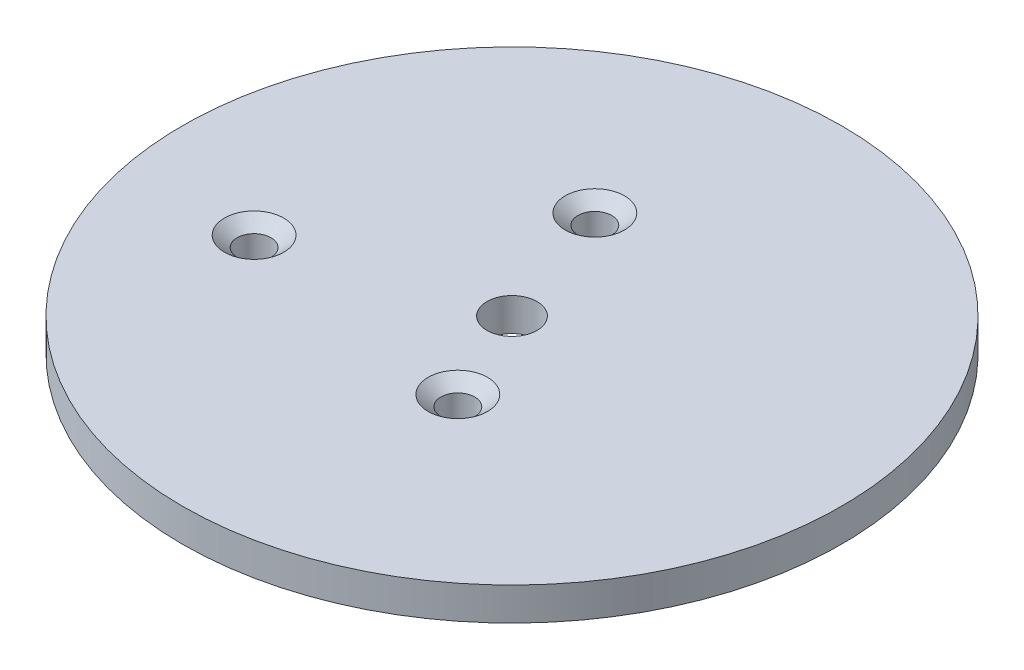
ISO-10303-21;
HEADER;
FILE_DESCRIPTION(('STEP AP214'),'2;1');
FILE_NAME('part.step','',(''),(''),'','','');
FILE_SCHEMA(('AUTOMOTIVE_DESIGN { 1 0 10303 214 1 1 1 1 }'));
ENDSEC;
DATA;
#1=APPLICATION_CONTEXT('core data for automotive mechanical design processes');
#2=APPLICATION_PROTOCOL_DEFINITION('international standard','automotive_design',2000,#1);
#3=PRODUCT_CONTEXT('',#1,'mechanical');
#4=PRODUCT('Part','Part','',(#3));
#5=PRODUCT_RELATED_PRODUCT_CATEGORY('part','',(#4));
#6=PRODUCT_DEFINITION_FORMATION('','',#4);
#7=PRODUCT_DEFINITION_CONTEXT('part definition',#1,'design');
#8=PRODUCT_DEFINITION('design','',#6,#7);
#9=PRODUCT_DEFINITION_SHAPE('','',#8);
#10=(LENGTH_UNIT() NAMED_UNIT(*) SI_UNIT(.MILLI.,.METRE.));
#11=(NAMED_UNIT(*) PLANE_ANGLE_UNIT() SI_UNIT($,.RADIAN.));
#12=(NAMED_UNIT(*) SI_UNIT($,.STERADIAN.) SOLID_ANGLE_UNIT());
#13=UNCERTAINTY_MEASURE_WITH_UNIT(LENGTH_MEASURE(1.E-05),#10,'distance_accuracy_value','');
#14=(GEOMETRIC_REPRESENTATION_CONTEXT(3) GLOBAL_UNCERTAINTY_ASSIGNED_CONTEXT((#13)) GLOBAL_UNIT_ASSIGNED_CONTEXT((#10,
#11,#12)) REPRESENTATION_CONTEXT('',''));
#15=CARTESIAN_POINT('',(0.,0.,0.));
#16=DIRECTION('',(0.,0.,1.));
#17=DIRECTION('',(1.,0.,0.));
#18=AXIS2_PLACEMENT_3D('',#15,#16,#17);
#19=CARTESIAN_POINT('',(0.,3.175,0.));
#20=DIRECTION('',(0.,-1.,0.));
#21=DIRECTION('',(0.,0.,-1.));
#22=AXIS2_PLACEMENT_3D('',#19,#20,#21);
#23=CYLINDRICAL_SURFACE('',#22,31.75);
#24=CARTESIAN_POINT('',(0.,3.175,0.));
#25=DIRECTION('',(0.,1.,0.));
#26=DIRECTION('',(0.,0.,1.));
#27=AXIS2_PLACEMENT_3D('',#24,#25,#26);
#28=CIRCLE('',#27,31.75);
#29=CARTESIAN_POINT('',(0.,3.175,31.75));
#30=VERTEX_POINT('',#29);
#31=EDGE_CURVE('E10',#30,#30,#28,.T.);
#32=ORIENTED_EDGE('',*,*,#31,.F.);
#33=EDGE_LOOP('',(#32));
#34=FACE_BOUND('',#33,.T.);
#35=CARTESIAN_POINT('',(0.,0.,0.));
#36=DIRECTION('',(0.,1.,0.));
#37=DIRECTION('',(0.,0.,1.));
#38=AXIS2_PLACEMENT_3D('',#35,#36,#37);
#39=CIRCLE('',#38,31.75);
#40=CARTESIAN_POINT('',(0.,0.,31.75));
#41=VERTEX_POINT('',#40);
#42=EDGE_CURVE('E38',#41,#41,#39,.T.);
#43=ORIENTED_EDGE('',*,*,#42,.T.);
#44=EDGE_LOOP('',(#43));
#45=FACE_BOUND('',#44,.T.);
#46=ADVANCED_FACE('F35',(#34,#45),#23,.T.);
#47=CARTESIAN_POINT('',(0.,3.175,0.));
#48=DIRECTION('',(0.,1.,0.));
#49=DIRECTION('',(0.,0.,1.));
#50=AXIS2_PLACEMENT_3D('',#47,#48,#49);
#51=PLANE('',#50);
#52=CARTESIAN_POINT('',(3.93552440882241,3.175,9.1528076737525));
#53=DIRECTION('',(0.,1.,0.));
#54=DIRECTION('',(0.,0.,1.));
#55=AXIS2_PLACEMENT_3D('',#52,#53,#54);
#56=CIRCLE('',#55,2.8575);
#57=CARTESIAN_POINT('',(3.93552440882241,3.175,12.0103076737525));
#58=VERTEX_POINT('',#57);
#59=EDGE_CURVE('E85',#58,#58,#56,.T.);
#60=ORIENTED_EDGE('',*,*,#59,.F.);
#61=EDGE_LOOP('',(#60));
#62=FACE_BOUND('',#61,.T.);
#63=CARTESIAN_POINT('',(-19.1657861345776,3.175,5.68015343565319));
#64=DIRECTION('',(0.,1.,0.));
#65=DIRECTION('',(0.,0.,1.));
#66=AXIS2_PLACEMENT_3D('',#63,#64,#65);
#67=CIRCLE('',#66,2.8575);
#68=CARTESIAN_POINT('',(-19.1657861345776,3.175,8.53765343565319));
#69=VERTEX_POINT('',#68);
#70=EDGE_CURVE('E75',#69,#69,#67,.T.);
#71=ORIENTED_EDGE('',*,*,#70,.F.);
#72=EDGE_LOOP('',(#71));
#73=FACE_BOUND('',#72,.T.);
#74=CARTESIAN_POINT('',(-4.60772407412391,3.175,-12.5898412365949));
#75=DIRECTION('',(0.,1.,0.));
#76=DIRECTION('',(0.,0.,1.));
#77=AXIS2_PLACEMENT_3D('',#74,#75,#76);
#78=CIRCLE('',#77,2.8575);
#79=CARTESIAN_POINT('',(-4.60772407412391,3.175,-9.73234123659489));
#80=VERTEX_POINT('',#79);
#81=EDGE_CURVE('E65',#80,#80,#78,.T.);
#82=ORIENTED_EDGE('',*,*,#81,.F.);
#83=EDGE_LOOP('',(#82));
#84=FACE_BOUND('',#83,.T.);
#85=CARTESIAN_POINT('',(0.,3.175,0.));
#86=DIRECTION('',(0.,1.,0.));
#87=DIRECTION('',(0.,0.,1.));
#88=AXIS2_PLACEMENT_3D('',#85,#86,#87);
#89=CIRCLE('',#88,2.413);
#90=CARTESIAN_POINT('',(0.,3.175,2.413));
#91=VERTEX_POINT('',#90);
#92=EDGE_CURVE('E50',#91,#91,#89,.T.);
#93=ORIENTED_EDGE('',*,*,#92,.F.);
#94=EDGE_LOOP('',(#93));
#95=FACE_BOUND('',#94,.T.);
#96=ORIENTED_EDGE('',*,*,#31,.T.);
#97=EDGE_LOOP('',(#96));
#98=FACE_BOUND('',#97,.T.);
#99=ADVANCED_FACE('F92',(#62,#73,#84,#95,#98),#51,.T.);
#100=CARTESIAN_POINT('',(0.,0.,0.));
#101=DIRECTION('',(0.,1.,0.));
#102=DIRECTION('',(0.,0.,1.));
#103=AXIS2_PLACEMENT_3D('',#100,#101,#102);
#104=PLANE('',#103);
#105=CARTESIAN_POINT('',(3.93552440882241,0.,9.1528076737525));
#106=DIRECTION('',(0.,1.,0.));
#107=DIRECTION('',(0.,0.,1.));
#108=AXIS2_PLACEMENT_3D('',#105,#106,#107);
#109=CIRCLE('',#108,1.63195);
#110=CARTESIAN_POINT('',(3.93552440882241,0.,10.7847576737525));
#111=VERTEX_POINT('',#110);
#112=EDGE_CURVE('E78',#111,#111,#109,.T.);
#113=ORIENTED_EDGE('',*,*,#112,.T.);
#114=EDGE_LOOP('',(#113));
#115=FACE_BOUND('',#114,.T.);
#116=CARTESIAN_POINT('',(-19.1657861345776,0.,5.68015343565319));
#117=DIRECTION('',(0.,1.,0.));
#118=DIRECTION('',(0.,0.,1.));
#119=AXIS2_PLACEMENT_3D('',#116,#117,#118);
#120=CIRCLE('',#119,1.63195);
#121=CARTESIAN_POINT('',(-19.1657861345776,0.,7.31210343565319));
#122=VERTEX_POINT('',#121);
#123=EDGE_CURVE('E69',#122,#122,#120,.T.);
#124=ORIENTED_EDGE('',*,*,#123,.T.);
#125=EDGE_LOOP('',(#124));
#126=FACE_BOUND('',#125,.T.);
#127=CARTESIAN_POINT('',(-4.60772407412391,0.,-12.5898412365949));
#128=DIRECTION('',(0.,1.,0.));
#129=DIRECTION('',(0.,0.,1.));
#130=AXIS2_PLACEMENT_3D('',#127,#128,#129);
#131=CIRCLE('',#130,1.63195);
#132=CARTESIAN_POINT('',(-4.60772407412391,0.,-10.9578912365949));
#133=VERTEX_POINT('',#132);
#134=EDGE_CURVE('E54',#133,#133,#131,.T.);
#135=ORIENTED_EDGE('',*,*,#134,.T.);
#136=EDGE_LOOP('',(#135));
#137=FACE_BOUND('',#136,.T.);
#138=CARTESIAN_POINT('',(0.,0.,0.));
#139=DIRECTION('',(0.,1.,0.));
#140=DIRECTION('',(0.,0.,1.));
#141=AXIS2_PLACEMENT_3D('',#138,#139,#140);
#142=CIRCLE('',#141,2.413);
#143=CARTESIAN_POINT('',(0.,0.,2.413));
#144=VERTEX_POINT('',#143);
#145=EDGE_CURVE('E48',#144,#144,#142,.T.);
#146=ORIENTED_EDGE('',*,*,#145,.T.);
#147=EDGE_LOOP('',(#146));
#148=FACE_BOUND('',#147,.T.);
#149=ORIENTED_EDGE('',*,*,#42,.F.);
#150=EDGE_LOOP('',(#149));
#151=FACE_BOUND('',#150,.T.);
#152=ADVANCED_FACE('F95',(#115,#126,#137,#148,#151),#104,.F.);
#153=CARTESIAN_POINT('',(0.,0.,0.));
#154=DIRECTION('',(0.,1.,0.));
#155=DIRECTION('',(0.,0.,1.));
#156=AXIS2_PLACEMENT_3D('',#153,#154,#155);
#157=CYLINDRICAL_SURFACE('',#156,2.413);
#158=ORIENTED_EDGE('',*,*,#145,.F.);
#159=EDGE_LOOP('',(#158));
#160=FACE_BOUND('',#159,.T.);
#161=ORIENTED_EDGE('',*,*,#92,.T.);
#162=EDGE_LOOP('',(#161));
#163=FACE_BOUND('',#162,.T.);
#164=ADVANCED_FACE('F103',(#160,#163),#157,.F.);
#165=CARTESIAN_POINT('',(-4.60772407412391,3.175,-12.5898412365949));
#166=DIRECTION('',(0.,1.,0.));
#167=DIRECTION('',(0.,0.,1.));
#168=AXIS2_PLACEMENT_3D('',#165,#166,#167);
#169=CYLINDRICAL_SURFACE('',#168,1.63195);
#170=ORIENTED_EDGE('',*,*,#134,.F.);
#171=EDGE_LOOP('',(#170));
#172=FACE_BOUND('',#171,.T.);
#173=CARTESIAN_POINT('',(-4.60772407412391,2.14664144701069,-12.5898412365949));
#174=DIRECTION('',(0.,1.,0.));
#175=DIRECTION('',(0.,0.,1.));
#176=AXIS2_PLACEMENT_3D('',#173,#174,#175);
#177=CIRCLE('',#176,1.63195);
#178=CARTESIAN_POINT('',(-4.60772407412391,2.14664144701069,-10.9578912365949));
#179=VERTEX_POINT('',#178);
#180=EDGE_CURVE('E61',#179,#179,#177,.T.);
#181=ORIENTED_EDGE('',*,*,#180,.T.);
#182=EDGE_LOOP('',(#181));
#183=FACE_BOUND('',#182,.T.);
#184=ADVANCED_FACE('F105',(#172,#183),#169,.F.);
#185=CARTESIAN_POINT('',(-4.60772407412391,3.175,-12.5898412365949));
#186=DIRECTION('',(0.,1.,0.));
#187=DIRECTION('',(0.,0.,1.));
#188=AXIS2_PLACEMENT_3D('',#185,#186,#187);
#189=CONICAL_SURFACE('',#188,2.8575,0.872664625997166);
#190=ORIENTED_EDGE('',*,*,#180,.F.);
#191=EDGE_LOOP('',(#190));
#192=FACE_BOUND('',#191,.T.);
#193=ORIENTED_EDGE('',*,*,#81,.T.);
#194=EDGE_LOOP('',(#193));
#195=FACE_BOUND('',#194,.T.);
#196=ADVANCED_FACE('F112',(#192,#195),#189,.F.);
#197=CARTESIAN_POINT('',(-19.1657861345776,3.175,5.68015343565319));
#198=DIRECTION('',(0.,1.,0.));
#199=DIRECTION('',(0.,0.,1.));
#200=AXIS2_PLACEMENT_3D('',#197,#198,#199);
#201=CYLINDRICAL_SURFACE('',#200,1.63195);
#202=ORIENTED_EDGE('',*,*,#123,.F.);
#203=EDGE_LOOP('',(#202));
#204=FACE_BOUND('',#203,.T.);
#205=CARTESIAN_POINT('',(-19.1657861345776,2.14664144701069,5.68015343565319));
#206=DIRECTION('',(0.,1.,0.));
#207=DIRECTION('',(0.,0.,1.));
#208=AXIS2_PLACEMENT_3D('',#205,#206,#207);
#209=CIRCLE('',#208,1.63195);
#210=CARTESIAN_POINT('',(-19.1657861345776,2.14664144701069,7.31210343565319));
#211=VERTEX_POINT('',#210);
#212=EDGE_CURVE('E72',#211,#211,#209,.T.);
#213=ORIENTED_EDGE('',*,*,#212,.T.);
#214=EDGE_LOOP('',(#213));
#215=FACE_BOUND('',#214,.T.);
#216=ADVANCED_FACE('F151',(#204,#215),#201,.F.);
#217=CARTESIAN_POINT('',(-19.1657861345776,3.175,5.68015343565319));
#218=DIRECTION('',(0.,1.,0.));
#219=DIRECTION('',(0.,0.,1.));
#220=AXIS2_PLACEMENT_3D('',#217,#218,#219);
#221=CONICAL_SURFACE('',#220,2.8575,0.872664625997166);
#222=ORIENTED_EDGE('',*,*,#212,.F.);
#223=EDGE_LOOP('',(#222));
#224=FACE_BOUND('',#223,.T.);
#225=ORIENTED_EDGE('',*,*,#70,.T.);
#226=EDGE_LOOP('',(#225));
#227=FACE_BOUND('',#226,.T.);
#228=ADVANCED_FACE('F160',(#224,#227),#221,.F.);
#229=CARTESIAN_POINT('',(3.93552440882241,3.175,9.1528076737525));
#230=DIRECTION('',(0.,1.,0.));
#231=DIRECTION('',(0.,0.,1.));
#232=AXIS2_PLACEMENT_3D('',#229,#230,#231);
#233=CYLINDRICAL_SURFACE('',#232,1.63195);
#234=ORIENTED_EDGE('',*,*,#112,.F.);
#235=EDGE_LOOP('',(#234));
#236=FACE_BOUND('',#235,.T.);
#237=CARTESIAN_POINT('',(3.93552440882241,2.14664144701069,9.1528076737525));
#238=DIRECTION('',(0.,1.,0.));
#239=DIRECTION('',(0.,0.,1.));
#240=AXIS2_PLACEMENT_3D('',#237,#238,#239);
#241=CIRCLE('',#240,1.63195);
#242=CARTESIAN_POINT('',(3.93552440882241,2.14664144701069,10.7847576737525));
#243=VERTEX_POINT('',#242);
#244=EDGE_CURVE('E81',#243,#243,#241,.T.);
#245=ORIENTED_EDGE('',*,*,#244,.T.);
#246=EDGE_LOOP('',(#245));
#247=FACE_BOUND('',#246,.T.);
#248=ADVANCED_FACE('F170',(#236,#247),#233,.F.);
#249=CARTESIAN_POINT('',(3.93552440882241,3.175,9.1528076737525));
#250=DIRECTION('',(0.,1.,0.));
#251=DIRECTION('',(0.,0.,1.));
#252=AXIS2_PLACEMENT_3D('',#249,#250,#251);
#253=CONICAL_SURFACE('',#252,2.8575,0.872664625997166);
#254=ORIENTED_EDGE('',*,*,#244,.F.);
#255=EDGE_LOOP('',(#254));
#256=FACE_BOUND('',#255,.T.);
#257=ORIENTED_EDGE('',*,*,#59,.T.);
#258=EDGE_LOOP('',(#257));
#259=FACE_BOUND('',#258,.T.);
#260=ADVANCED_FACE('F90',(#256,#259),#253,.F.);
#261=CLOSED_SHELL('',(#46,#99,#152,#164,#184,#196,#216,#228,#248,#260));
#262=MANIFOLD_SOLID_BREP('B2',#261);
#263=ADVANCED_BREP_SHAPE_REPRESENTATION('',(#18,#262),#14);
#264=SHAPE_DEFINITION_REPRESENTATION(#9,#263);
ENDSEC;
END-ISO-10303-21;
